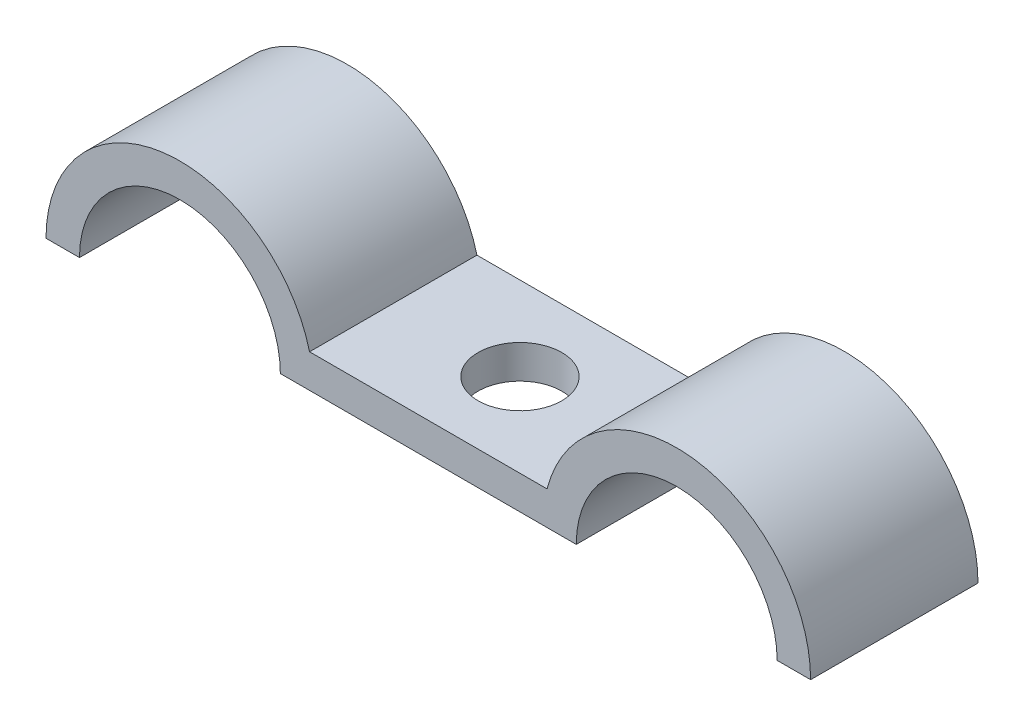
ISO-10303-21;
HEADER;
FILE_DESCRIPTION(('STEP AP214'),'2;1');
FILE_NAME('part.step','',(''),(''),'','','');
FILE_SCHEMA(('AUTOMOTIVE_DESIGN { 1 0 10303 214 1 1 1 1 }'));
ENDSEC;
DATA;
#1=APPLICATION_CONTEXT('core data for automotive mechanical design processes');
#2=APPLICATION_PROTOCOL_DEFINITION('international standard','automotive_design',2000,#1);
#3=PRODUCT_CONTEXT('',#1,'mechanical');
#4=PRODUCT('Part','Part','',(#3));
#5=PRODUCT_RELATED_PRODUCT_CATEGORY('part','',(#4));
#6=PRODUCT_DEFINITION_FORMATION('','',#4);
#7=PRODUCT_DEFINITION_CONTEXT('part definition',#1,'design');
#8=PRODUCT_DEFINITION('design','',#6,#7);
#9=PRODUCT_DEFINITION_SHAPE('','',#8);
#10=(LENGTH_UNIT() NAMED_UNIT(*) SI_UNIT(.MILLI.,.METRE.));
#11=(NAMED_UNIT(*) PLANE_ANGLE_UNIT() SI_UNIT($,.RADIAN.));
#12=(NAMED_UNIT(*) SI_UNIT($,.STERADIAN.) SOLID_ANGLE_UNIT());
#13=UNCERTAINTY_MEASURE_WITH_UNIT(LENGTH_MEASURE(1.E-05),#10,'distance_accuracy_value','');
#14=(GEOMETRIC_REPRESENTATION_CONTEXT(3) GLOBAL_UNCERTAINTY_ASSIGNED_CONTEXT((#13)) GLOBAL_UNIT_ASSIGNED_CONTEXT((#10,
#11,#12)) REPRESENTATION_CONTEXT('',''));
#15=CARTESIAN_POINT('',(0.,0.,0.));
#16=DIRECTION('',(0.,0.,1.));
#17=DIRECTION('',(1.,0.,0.));
#18=AXIS2_PLACEMENT_3D('',#15,#16,#17);
#19=CARTESIAN_POINT('',(-6.,0.,10.));
#20=DIRECTION('',(0.,0.,-1.));
#21=DIRECTION('',(-1.,0.,0.));
#22=AXIS2_PLACEMENT_3D('',#19,#20,#21);
#23=CYLINDRICAL_SURFACE('',#22,6.);
#24=CARTESIAN_POINT('',(-6.,0.,0.));
#25=DIRECTION('',(0.,0.,-1.));
#26=DIRECTION('',(1.,0.,0.));
#27=AXIS2_PLACEMENT_3D('',#24,#25,#26);
#28=CIRCLE('',#27,6.);
#29=CARTESIAN_POINT('',(-12.,0.,0.));
#30=VERTEX_POINT('',#29);
#31=CARTESIAN_POINT('',(0.,0.,0.));
#32=VERTEX_POINT('',#31);
#33=EDGE_CURVE('E129',#30,#32,#28,.T.);
#34=ORIENTED_EDGE('',*,*,#33,.T.);
#35=DIRECTION('',(0.,0.,-1.));
#36=VECTOR('',#35,1.);
#37=CARTESIAN_POINT('',(0.,0.,10.));
#38=LINE('',#37,#36);
#39=CARTESIAN_POINT('',(0.,0.,10.));
#40=VERTEX_POINT('',#39);
#41=EDGE_CURVE('E11',#40,#32,#38,.T.);
#42=ORIENTED_EDGE('',*,*,#41,.F.);
#43=CARTESIAN_POINT('',(-6.,0.,10.));
#44=DIRECTION('',(0.,0.,-1.));
#45=DIRECTION('',(1.,0.,0.));
#46=AXIS2_PLACEMENT_3D('',#43,#44,#45);
#47=CIRCLE('',#46,6.);
#48=CARTESIAN_POINT('',(-12.,0.,10.));
#49=VERTEX_POINT('',#48);
#50=EDGE_CURVE('E144',#49,#40,#47,.T.);
#51=ORIENTED_EDGE('',*,*,#50,.F.);
#52=DIRECTION('',(0.,0.,-1.));
#53=VECTOR('',#52,1.);
#54=CARTESIAN_POINT('',(-12.,0.,10.));
#55=LINE('',#54,#53);
#56=EDGE_CURVE('E125',#49,#30,#55,.T.);
#57=ORIENTED_EDGE('',*,*,#56,.T.);
#58=EDGE_LOOP('',(#34,#42,#51,#57));
#59=FACE_BOUND('',#58,.T.);
#60=ADVANCED_FACE('F32',(#59),#23,.F.);
#61=CARTESIAN_POINT('',(0.,0.,10.));
#62=DIRECTION('',(0.,1.,0.));
#63=DIRECTION('',(0.,0.,1.));
#64=AXIS2_PLACEMENT_3D('',#61,#62,#63);
#65=PLANE('',#64);
#66=CARTESIAN_POINT('',(9.316,0.,5.));
#67=DIRECTION('',(0.,1.,0.));
#68=DIRECTION('',(0.,0.,1.));
#69=AXIS2_PLACEMENT_3D('',#66,#67,#68);
#70=CIRCLE('',#69,2.5);
#71=CARTESIAN_POINT('',(9.316,0.,7.5));
#72=VERTEX_POINT('',#71);
#73=EDGE_CURVE('E133',#72,#72,#70,.F.);
#74=ORIENTED_EDGE('',*,*,#73,.F.);
#75=EDGE_LOOP('',(#74));
#76=FACE_BOUND('',#75,.T.);
#77=DIRECTION('',(1.,0.,0.));
#78=VECTOR('',#77,1.);
#79=CARTESIAN_POINT('',(0.,0.,0.));
#80=LINE('',#79,#78);
#81=CARTESIAN_POINT('',(17.68,0.,0.));
#82=VERTEX_POINT('',#81);
#83=EDGE_CURVE('E132',#32,#82,#80,.T.);
#84=ORIENTED_EDGE('',*,*,#83,.T.);
#85=DIRECTION('',(0.,0.,-1.));
#86=VECTOR('',#85,1.);
#87=CARTESIAN_POINT('',(17.68,0.,10.));
#88=LINE('',#87,#86);
#89=CARTESIAN_POINT('',(17.68,0.,10.));
#90=VERTEX_POINT('',#89);
#91=EDGE_CURVE('E41',#90,#82,#88,.T.);
#92=ORIENTED_EDGE('',*,*,#91,.F.);
#93=DIRECTION('',(1.,0.,0.));
#94=VECTOR('',#93,1.);
#95=CARTESIAN_POINT('',(0.,0.,10.));
#96=LINE('',#95,#94);
#97=EDGE_CURVE('E92',#40,#90,#96,.T.);
#98=ORIENTED_EDGE('',*,*,#97,.F.);
#99=ORIENTED_EDGE('',*,*,#41,.T.);
#100=EDGE_LOOP('',(#84,#92,#98,#99));
#101=FACE_BOUND('',#100,.T.);
#102=ADVANCED_FACE('F196',(#76,#101),#65,.F.);
#103=CARTESIAN_POINT('',(23.68,0.,10.));
#104=DIRECTION('',(0.,0.,-1.));
#105=DIRECTION('',(-1.,0.,0.));
#106=AXIS2_PLACEMENT_3D('',#103,#104,#105);
#107=CYLINDRICAL_SURFACE('',#106,6.);
#108=CARTESIAN_POINT('',(23.68,0.,0.));
#109=DIRECTION('',(0.,0.,-1.));
#110=DIRECTION('',(1.,0.,0.));
#111=AXIS2_PLACEMENT_3D('',#108,#109,#110);
#112=CIRCLE('',#111,6.);
#113=CARTESIAN_POINT('',(29.68,0.,0.));
#114=VERTEX_POINT('',#113);
#115=EDGE_CURVE('E135',#82,#114,#112,.T.);
#116=ORIENTED_EDGE('',*,*,#115,.T.);
#117=DIRECTION('',(0.,0.,-1.));
#118=VECTOR('',#117,1.);
#119=CARTESIAN_POINT('',(29.68,0.,10.));
#120=LINE('',#119,#118);
#121=CARTESIAN_POINT('',(29.68,0.,10.));
#122=VERTEX_POINT('',#121);
#123=EDGE_CURVE('E151',#122,#114,#120,.T.);
#124=ORIENTED_EDGE('',*,*,#123,.F.);
#125=CARTESIAN_POINT('',(23.68,0.,10.));
#126=DIRECTION('',(0.,0.,-1.));
#127=DIRECTION('',(1.,0.,0.));
#128=AXIS2_PLACEMENT_3D('',#125,#126,#127);
#129=CIRCLE('',#128,6.);
#130=EDGE_CURVE('E160',#90,#122,#129,.T.);
#131=ORIENTED_EDGE('',*,*,#130,.F.);
#132=ORIENTED_EDGE('',*,*,#91,.T.);
#133=EDGE_LOOP('',(#116,#124,#131,#132));
#134=FACE_BOUND('',#133,.T.);
#135=ADVANCED_FACE('F158',(#134),#107,.F.);
#136=CARTESIAN_POINT('',(29.68,0.,10.));
#137=DIRECTION('',(0.,1.,0.));
#138=DIRECTION('',(0.,0.,1.));
#139=AXIS2_PLACEMENT_3D('',#136,#137,#138);
#140=PLANE('',#139);
#141=DIRECTION('',(1.,0.,0.));
#142=VECTOR('',#141,1.);
#143=CARTESIAN_POINT('',(29.68,0.,0.));
#144=LINE('',#143,#142);
#145=CARTESIAN_POINT('',(31.68,0.,0.));
#146=VERTEX_POINT('',#145);
#147=EDGE_CURVE('E137',#114,#146,#144,.T.);
#148=ORIENTED_EDGE('',*,*,#147,.T.);
#149=DIRECTION('',(0.,0.,-1.));
#150=VECTOR('',#149,1.);
#151=CARTESIAN_POINT('',(31.68,0.,10.));
#152=LINE('',#151,#150);
#153=CARTESIAN_POINT('',(31.68,0.,10.));
#154=VERTEX_POINT('',#153);
#155=EDGE_CURVE('E148',#154,#146,#152,.T.);
#156=ORIENTED_EDGE('',*,*,#155,.F.);
#157=DIRECTION('',(1.,0.,0.));
#158=VECTOR('',#157,1.);
#159=CARTESIAN_POINT('',(29.68,0.,10.));
#160=LINE('',#159,#158);
#161=EDGE_CURVE('E172',#122,#154,#160,.T.);
#162=ORIENTED_EDGE('',*,*,#161,.F.);
#163=ORIENTED_EDGE('',*,*,#123,.T.);
#164=EDGE_LOOP('',(#148,#156,#162,#163));
#165=FACE_BOUND('',#164,.T.);
#166=ADVANCED_FACE('F168',(#165),#140,.F.);
#167=CARTESIAN_POINT('',(23.68,0.,10.));
#168=DIRECTION('',(0.,0.,-1.));
#169=DIRECTION('',(-1.,0.,0.));
#170=AXIS2_PLACEMENT_3D('',#167,#168,#169);
#171=CYLINDRICAL_SURFACE('',#170,8.);
#172=CARTESIAN_POINT('',(23.68,0.,0.));
#173=DIRECTION('',(0.,0.,1.));
#174=DIRECTION('',(1.,0.,0.));
#175=AXIS2_PLACEMENT_3D('',#172,#173,#174);
#176=CIRCLE('',#175,8.);
#177=CARTESIAN_POINT('',(15.9340333075852,2.,0.));
#178=VERTEX_POINT('',#177);
#179=EDGE_CURVE('E139',#146,#178,#176,.T.);
#180=ORIENTED_EDGE('',*,*,#179,.T.);
#181=DIRECTION('',(0.,0.,-1.));
#182=VECTOR('',#181,1.);
#183=CARTESIAN_POINT('',(15.9340333075852,2.,10.));
#184=LINE('',#183,#182);
#185=CARTESIAN_POINT('',(15.9340333075852,2.,10.));
#186=VERTEX_POINT('',#185);
#187=EDGE_CURVE('E120',#186,#178,#184,.T.);
#188=ORIENTED_EDGE('',*,*,#187,.F.);
#189=CARTESIAN_POINT('',(23.68,0.,10.));
#190=DIRECTION('',(0.,0.,1.));
#191=DIRECTION('',(1.,0.,0.));
#192=AXIS2_PLACEMENT_3D('',#189,#190,#191);
#193=CIRCLE('',#192,8.);
#194=EDGE_CURVE('E111',#154,#186,#193,.T.);
#195=ORIENTED_EDGE('',*,*,#194,.F.);
#196=ORIENTED_EDGE('',*,*,#155,.T.);
#197=EDGE_LOOP('',(#180,#188,#195,#196));
#198=FACE_BOUND('',#197,.T.);
#199=ADVANCED_FACE('F171',(#198),#171,.T.);
#200=CARTESIAN_POINT('',(15.9340333075852,2.,10.));
#201=DIRECTION('',(0.,-1.,0.));
#202=DIRECTION('',(1.,0.,0.));
#203=AXIS2_PLACEMENT_3D('',#200,#201,#202);
#204=PLANE('',#203);
#205=CARTESIAN_POINT('',(9.316,2.,5.));
#206=DIRECTION('',(0.,-1.,0.));
#207=DIRECTION('',(1.,0.,0.));
#208=AXIS2_PLACEMENT_3D('',#205,#206,#207);
#209=CIRCLE('',#208,2.5);
#210=CARTESIAN_POINT('',(11.816,2.,5.));
#211=VERTEX_POINT('',#210);
#212=EDGE_CURVE('E35',#211,#211,#209,.F.);
#213=ORIENTED_EDGE('',*,*,#212,.F.);
#214=EDGE_LOOP('',(#213));
#215=FACE_BOUND('',#214,.T.);
#216=DIRECTION('',(-1.,0.,0.));
#217=VECTOR('',#216,1.);
#218=CARTESIAN_POINT('',(15.9340333075852,2.,0.));
#219=LINE('',#218,#217);
#220=CARTESIAN_POINT('',(1.74596669241483,2.,0.));
#221=VERTEX_POINT('',#220);
#222=EDGE_CURVE('E119',#178,#221,#219,.T.);
#223=ORIENTED_EDGE('',*,*,#222,.T.);
#224=DIRECTION('',(0.,0.,-1.));
#225=VECTOR('',#224,1.);
#226=CARTESIAN_POINT('',(1.74596669241483,2.,10.));
#227=LINE('',#226,#225);
#228=CARTESIAN_POINT('',(1.74596669241483,2.,10.));
#229=VERTEX_POINT('',#228);
#230=EDGE_CURVE('E116',#229,#221,#227,.T.);
#231=ORIENTED_EDGE('',*,*,#230,.F.);
#232=DIRECTION('',(-1.,0.,0.));
#233=VECTOR('',#232,1.);
#234=CARTESIAN_POINT('',(15.9340333075852,2.,10.));
#235=LINE('',#234,#233);
#236=EDGE_CURVE('E105',#186,#229,#235,.T.);
#237=ORIENTED_EDGE('',*,*,#236,.F.);
#238=ORIENTED_EDGE('',*,*,#187,.T.);
#239=EDGE_LOOP('',(#223,#231,#237,#238));
#240=FACE_BOUND('',#239,.T.);
#241=ADVANCED_FACE('F117',(#215,#240),#204,.F.);
#242=CARTESIAN_POINT('',(-6.,0.,10.));
#243=DIRECTION('',(0.,0.,-1.));
#244=DIRECTION('',(-1.,0.,0.));
#245=AXIS2_PLACEMENT_3D('',#242,#243,#244);
#246=CYLINDRICAL_SURFACE('',#245,8.);
#247=CARTESIAN_POINT('',(-6.,0.,0.));
#248=DIRECTION('',(0.,0.,1.));
#249=DIRECTION('',(1.,0.,0.));
#250=AXIS2_PLACEMENT_3D('',#247,#248,#249);
#251=CIRCLE('',#250,8.);
#252=CARTESIAN_POINT('',(-14.,0.,0.));
#253=VERTEX_POINT('',#252);
#254=EDGE_CURVE('E78',#221,#253,#251,.T.);
#255=ORIENTED_EDGE('',*,*,#254,.T.);
#256=DIRECTION('',(0.,0.,-1.));
#257=VECTOR('',#256,1.);
#258=CARTESIAN_POINT('',(-14.,0.,10.));
#259=LINE('',#258,#257);
#260=CARTESIAN_POINT('',(-14.,0.,10.));
#261=VERTEX_POINT('',#260);
#262=EDGE_CURVE('E121',#261,#253,#259,.T.);
#263=ORIENTED_EDGE('',*,*,#262,.F.);
#264=CARTESIAN_POINT('',(-6.,0.,10.));
#265=DIRECTION('',(0.,0.,1.));
#266=DIRECTION('',(1.,0.,0.));
#267=AXIS2_PLACEMENT_3D('',#264,#265,#266);
#268=CIRCLE('',#267,8.);
#269=EDGE_CURVE('E109',#229,#261,#268,.T.);
#270=ORIENTED_EDGE('',*,*,#269,.F.);
#271=ORIENTED_EDGE('',*,*,#230,.T.);
#272=EDGE_LOOP('',(#255,#263,#270,#271));
#273=FACE_BOUND('',#272,.T.);
#274=ADVANCED_FACE('F123',(#273),#246,.T.);
#275=CARTESIAN_POINT('',(-12.,0.,10.));
#276=DIRECTION('',(0.,1.,0.));
#277=DIRECTION('',(-1.,0.,0.));
#278=AXIS2_PLACEMENT_3D('',#275,#276,#277);
#279=PLANE('',#278);
#280=DIRECTION('',(1.,0.,0.));
#281=VECTOR('',#280,1.);
#282=CARTESIAN_POINT('',(-12.,0.,0.));
#283=LINE('',#282,#281);
#284=EDGE_CURVE('E84',#253,#30,#283,.T.);
#285=ORIENTED_EDGE('',*,*,#284,.T.);
#286=ORIENTED_EDGE('',*,*,#56,.F.);
#287=DIRECTION('',(1.,0.,0.));
#288=VECTOR('',#287,1.);
#289=CARTESIAN_POINT('',(-12.,0.,10.));
#290=LINE('',#289,#288);
#291=EDGE_CURVE('E49',#261,#49,#290,.T.);
#292=ORIENTED_EDGE('',*,*,#291,.F.);
#293=ORIENTED_EDGE('',*,*,#262,.T.);
#294=EDGE_LOOP('',(#285,#286,#292,#293));
#295=FACE_BOUND('',#294,.T.);
#296=ADVANCED_FACE('F192',(#295),#279,.F.);
#297=CARTESIAN_POINT('',(-6.,0.,10.));
#298=DIRECTION('',(0.,0.,1.));
#299=DIRECTION('',(1.,0.,0.));
#300=AXIS2_PLACEMENT_3D('',#297,#298,#299);
#301=PLANE('',#300);
#302=ORIENTED_EDGE('',*,*,#50,.T.);
#303=ORIENTED_EDGE('',*,*,#97,.T.);
#304=ORIENTED_EDGE('',*,*,#130,.T.);
#305=ORIENTED_EDGE('',*,*,#161,.T.);
#306=ORIENTED_EDGE('',*,*,#194,.T.);
#307=ORIENTED_EDGE('',*,*,#236,.T.);
#308=ORIENTED_EDGE('',*,*,#269,.T.);
#309=ORIENTED_EDGE('',*,*,#291,.T.);
#310=EDGE_LOOP('',(#302,#303,#304,#305,#306,#307,#308,#309));
#311=FACE_BOUND('',#310,.T.);
#312=ADVANCED_FACE('F107',(#311),#301,.T.);
#313=CARTESIAN_POINT('',(-6.,0.,0.));
#314=DIRECTION('',(0.,0.,1.));
#315=DIRECTION('',(1.,0.,0.));
#316=AXIS2_PLACEMENT_3D('',#313,#314,#315);
#317=PLANE('',#316);
#318=ORIENTED_EDGE('',*,*,#33,.F.);
#319=ORIENTED_EDGE('',*,*,#284,.F.);
#320=ORIENTED_EDGE('',*,*,#254,.F.);
#321=ORIENTED_EDGE('',*,*,#222,.F.);
#322=ORIENTED_EDGE('',*,*,#179,.F.);
#323=ORIENTED_EDGE('',*,*,#147,.F.);
#324=ORIENTED_EDGE('',*,*,#115,.F.);
#325=ORIENTED_EDGE('',*,*,#83,.F.);
#326=EDGE_LOOP('',(#318,#319,#320,#321,#322,#323,#324,#325));
#327=FACE_BOUND('',#326,.T.);
#328=ADVANCED_FACE('F164',(#327),#317,.F.);
#329=CARTESIAN_POINT('',(9.316,12.,5.));
#330=DIRECTION('',(0.,-1.,0.));
#331=DIRECTION('',(1.,0.,0.));
#332=AXIS2_PLACEMENT_3D('',#329,#330,#331);
#333=CYLINDRICAL_SURFACE('',#332,2.5);
#334=ORIENTED_EDGE('',*,*,#212,.T.);
#335=EDGE_LOOP('',(#334));
#336=FACE_BOUND('',#335,.T.);
#337=ORIENTED_EDGE('',*,*,#73,.T.);
#338=EDGE_LOOP('',(#337));
#339=FACE_BOUND('',#338,.T.);
#340=ADVANCED_FACE('F184',(#336,#339),#333,.F.);
#341=CLOSED_SHELL('',(#60,#102,#135,#166,#199,#241,#274,#296,#312,#328,#340));
#342=MANIFOLD_SOLID_BREP('B2',#341);
#343=ADVANCED_BREP_SHAPE_REPRESENTATION('',(#18,#342),#14);
#344=SHAPE_DEFINITION_REPRESENTATION(#9,#343);
ENDSEC;
END-ISO-10303-21;
